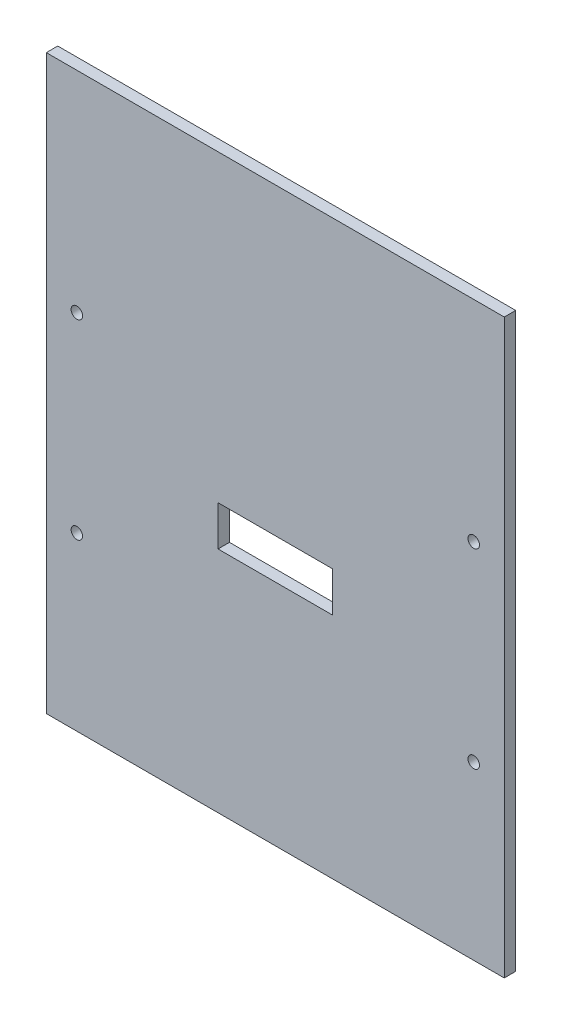
ISO-10303-21;
HEADER;
FILE_DESCRIPTION(('STEP AP214'),'2;1');
FILE_NAME('part.step','',(''),(''),'','','');
FILE_SCHEMA(('AUTOMOTIVE_DESIGN { 1 0 10303 214 1 1 1 1 }'));
ENDSEC;
DATA;
#1=APPLICATION_CONTEXT('core data for automotive mechanical design processes');
#2=APPLICATION_PROTOCOL_DEFINITION('international standard','automotive_design',2000,#1);
#3=PRODUCT_CONTEXT('',#1,'mechanical');
#4=PRODUCT('Part','Part','',(#3));
#5=PRODUCT_RELATED_PRODUCT_CATEGORY('part','',(#4));
#6=PRODUCT_DEFINITION_FORMATION('','',#4);
#7=PRODUCT_DEFINITION_CONTEXT('part definition',#1,'design');
#8=PRODUCT_DEFINITION('design','',#6,#7);
#9=PRODUCT_DEFINITION_SHAPE('','',#8);
#10=(LENGTH_UNIT() NAMED_UNIT(*) SI_UNIT(.MILLI.,.METRE.));
#11=(NAMED_UNIT(*) PLANE_ANGLE_UNIT() SI_UNIT($,.RADIAN.));
#12=(NAMED_UNIT(*) SI_UNIT($,.STERADIAN.) SOLID_ANGLE_UNIT());
#13=UNCERTAINTY_MEASURE_WITH_UNIT(LENGTH_MEASURE(1.E-05),#10,'distance_accuracy_value','');
#14=(GEOMETRIC_REPRESENTATION_CONTEXT(3) GLOBAL_UNCERTAINTY_ASSIGNED_CONTEXT((#13)) GLOBAL_UNIT_ASSIGNED_CONTEXT((#10,
#11,#12)) REPRESENTATION_CONTEXT('',''));
#15=CARTESIAN_POINT('',(0.,0.,0.));
#16=DIRECTION('',(0.,0.,1.));
#17=DIRECTION('',(1.,0.,0.));
#18=AXIS2_PLACEMENT_3D('',#15,#16,#17);
#19=CARTESIAN_POINT('',(0.,0.,3.));
#20=DIRECTION('',(0.,0.,-1.));
#21=DIRECTION('',(-1.,0.,0.));
#22=AXIS2_PLACEMENT_3D('',#19,#20,#21);
#23=PLANE('',#22);
#24=DIRECTION('',(1.,0.,0.));
#25=VECTOR('',#24,1.);
#26=CARTESIAN_POINT('',(0.,70.3610289769367,3.));
#27=LINE('',#26,#25);
#28=CARTESIAN_POINT('',(45.,70.3610289769367,3.));
#29=VERTEX_POINT('',#28);
#30=CARTESIAN_POINT('',(75.,70.3610289769367,3.));
#31=VERTEX_POINT('',#30);
#32=EDGE_CURVE('E144',#29,#31,#27,.T.);
#33=ORIENTED_EDGE('',*,*,#32,.T.);
#34=DIRECTION('',(0.,-1.,0.));
#35=VECTOR('',#34,1.);
#36=CARTESIAN_POINT('',(75.,0.,3.));
#37=LINE('',#36,#35);
#38=CARTESIAN_POINT('',(75.,59.8610289769367,3.));
#39=VERTEX_POINT('',#38);
#40=EDGE_CURVE('E148',#31,#39,#37,.T.);
#41=ORIENTED_EDGE('',*,*,#40,.T.);
#42=DIRECTION('',(-1.,0.,0.));
#43=VECTOR('',#42,1.);
#44=CARTESIAN_POINT('',(0.,59.8610289769367,3.));
#45=LINE('',#44,#43);
#46=CARTESIAN_POINT('',(45.,59.8610289769367,3.));
#47=VERTEX_POINT('',#46);
#48=EDGE_CURVE('E135',#39,#47,#45,.T.);
#49=ORIENTED_EDGE('',*,*,#48,.T.);
#50=DIRECTION('',(0.,1.,0.));
#51=VECTOR('',#50,1.);
#52=CARTESIAN_POINT('',(45.,0.,3.));
#53=LINE('',#52,#51);
#54=EDGE_CURVE('E110',#47,#29,#53,.T.);
#55=ORIENTED_EDGE('',*,*,#54,.T.);
#56=EDGE_LOOP('',(#33,#41,#49,#55));
#57=FACE_BOUND('',#56,.T.);
#58=DIRECTION('',(0.,-1.,0.));
#59=VECTOR('',#58,1.);
#60=CARTESIAN_POINT('',(0.,0.,3.));
#61=LINE('',#60,#59);
#62=CARTESIAN_POINT('',(0.,150.,3.));
#63=VERTEX_POINT('',#62);
#64=CARTESIAN_POINT('',(0.,0.,3.));
#65=VERTEX_POINT('',#64);
#66=EDGE_CURVE('E233',#63,#65,#61,.T.);
#67=ORIENTED_EDGE('',*,*,#66,.T.);
#68=DIRECTION('',(1.,0.,0.));
#69=VECTOR('',#68,1.);
#70=CARTESIAN_POINT('',(0.,0.,3.));
#71=LINE('',#70,#69);
#72=CARTESIAN_POINT('',(120.,0.,3.));
#73=VERTEX_POINT('',#72);
#74=EDGE_CURVE('E237',#65,#73,#71,.T.);
#75=ORIENTED_EDGE('',*,*,#74,.T.);
#76=DIRECTION('',(0.,1.,0.));
#77=VECTOR('',#76,1.);
#78=CARTESIAN_POINT('',(120.,0.,3.));
#79=LINE('',#78,#77);
#80=CARTESIAN_POINT('',(120.,150.,3.));
#81=VERTEX_POINT('',#80);
#82=EDGE_CURVE('E241',#73,#81,#79,.T.);
#83=ORIENTED_EDGE('',*,*,#82,.T.);
#84=DIRECTION('',(-1.,0.,0.));
#85=VECTOR('',#84,1.);
#86=CARTESIAN_POINT('',(0.,150.,3.));
#87=LINE('',#86,#85);
#88=EDGE_CURVE('E244',#81,#63,#87,.T.);
#89=ORIENTED_EDGE('',*,*,#88,.T.);
#90=EDGE_LOOP('',(#67,#75,#83,#89));
#91=FACE_BOUND('',#90,.T.);
#92=CARTESIAN_POINT('',(112.,95.,3.));
#93=DIRECTION('',(0.,0.,1.));
#94=DIRECTION('',(1.,0.,0.));
#95=AXIS2_PLACEMENT_3D('',#92,#93,#94);
#96=CIRCLE('',#95,1.5);
#97=CARTESIAN_POINT('',(113.5,95.,3.));
#98=VERTEX_POINT('',#97);
#99=EDGE_CURVE('E225',#98,#98,#96,.T.);
#100=ORIENTED_EDGE('',*,*,#99,.F.);
#101=EDGE_LOOP('',(#100));
#102=FACE_BOUND('',#101,.T.);
#103=CARTESIAN_POINT('',(112.,45.,3.));
#104=DIRECTION('',(0.,0.,1.));
#105=DIRECTION('',(1.,0.,0.));
#106=AXIS2_PLACEMENT_3D('',#103,#104,#105);
#107=CIRCLE('',#106,1.5);
#108=CARTESIAN_POINT('',(113.5,45.,3.));
#109=VERTEX_POINT('',#108);
#110=EDGE_CURVE('E217',#109,#109,#107,.T.);
#111=ORIENTED_EDGE('',*,*,#110,.F.);
#112=EDGE_LOOP('',(#111));
#113=FACE_BOUND('',#112,.T.);
#114=CARTESIAN_POINT('',(8.00000000000004,45.,3.));
#115=DIRECTION('',(0.,0.,1.));
#116=DIRECTION('',(-1.,0.,0.));
#117=AXIS2_PLACEMENT_3D('',#114,#115,#116);
#118=CIRCLE('',#117,1.5);
#119=CARTESIAN_POINT('',(6.50000000000004,45.,3.));
#120=VERTEX_POINT('',#119);
#121=EDGE_CURVE('E209',#120,#120,#118,.T.);
#122=ORIENTED_EDGE('',*,*,#121,.F.);
#123=EDGE_LOOP('',(#122));
#124=FACE_BOUND('',#123,.T.);
#125=CARTESIAN_POINT('',(8.00000000000002,95.,3.));
#126=DIRECTION('',(0.,0.,1.));
#127=DIRECTION('',(-1.,0.,0.));
#128=AXIS2_PLACEMENT_3D('',#125,#126,#127);
#129=CIRCLE('',#128,1.5);
#130=CARTESIAN_POINT('',(6.50000000000002,95.,3.));
#131=VERTEX_POINT('',#130);
#132=EDGE_CURVE('E201',#131,#131,#129,.T.);
#133=ORIENTED_EDGE('',*,*,#132,.F.);
#134=EDGE_LOOP('',(#133));
#135=FACE_BOUND('',#134,.T.);
#136=ADVANCED_FACE('F38',(#57,#91,#102,#113,#124,#135),#23,.F.);
#137=CARTESIAN_POINT('',(0.,0.,0.));
#138=DIRECTION('',(0.,0.,-1.));
#139=DIRECTION('',(-1.,0.,0.));
#140=AXIS2_PLACEMENT_3D('',#137,#138,#139);
#141=PLANE('',#140);
#142=DIRECTION('',(0.,-1.,0.));
#143=VECTOR('',#142,1.);
#144=CARTESIAN_POINT('',(75.,59.8610289769367,0.));
#145=LINE('',#144,#143);
#146=CARTESIAN_POINT('',(75.,70.3610289769367,0.));
#147=VERTEX_POINT('',#146);
#148=CARTESIAN_POINT('',(75.,59.8610289769367,0.));
#149=VERTEX_POINT('',#148);
#150=EDGE_CURVE('E62',#147,#149,#145,.T.);
#151=ORIENTED_EDGE('',*,*,#150,.F.);
#152=DIRECTION('',(1.,0.,0.));
#153=VECTOR('',#152,1.);
#154=CARTESIAN_POINT('',(75.,70.3610289769367,0.));
#155=LINE('',#154,#153);
#156=CARTESIAN_POINT('',(45.,70.3610289769367,0.));
#157=VERTEX_POINT('',#156);
#158=EDGE_CURVE('E125',#157,#147,#155,.T.);
#159=ORIENTED_EDGE('',*,*,#158,.F.);
#160=DIRECTION('',(0.,1.,0.));
#161=VECTOR('',#160,1.);
#162=CARTESIAN_POINT('',(45.,70.3610289769367,0.));
#163=LINE('',#162,#161);
#164=CARTESIAN_POINT('',(45.,59.8610289769367,0.));
#165=VERTEX_POINT('',#164);
#166=EDGE_CURVE('E107',#165,#157,#163,.T.);
#167=ORIENTED_EDGE('',*,*,#166,.F.);
#168=DIRECTION('',(-1.,0.,0.));
#169=VECTOR('',#168,1.);
#170=CARTESIAN_POINT('',(45.,59.8610289769367,0.));
#171=LINE('',#170,#169);
#172=EDGE_CURVE('E117',#149,#165,#171,.T.);
#173=ORIENTED_EDGE('',*,*,#172,.F.);
#174=EDGE_LOOP('',(#151,#159,#167,#173));
#175=FACE_BOUND('',#174,.T.);
#176=CARTESIAN_POINT('',(42.75,53.3041259645697,0.));
#177=DIRECTION('',(0.,0.,-1.));
#178=DIRECTION('',(1.,0.,0.));
#179=AXIS2_PLACEMENT_3D('',#176,#177,#178);
#180=CIRCLE('',#179,2.40336539543964);
#181=CARTESIAN_POINT('',(45.1533653954396,53.3041259645697,0.));
#182=VERTEX_POINT('',#181);
#183=EDGE_CURVE('E156',#182,#182,#180,.T.);
#184=ORIENTED_EDGE('',*,*,#183,.F.);
#185=EDGE_LOOP('',(#184));
#186=FACE_BOUND('',#185,.T.);
#187=CARTESIAN_POINT('',(77.25,53.3041259645697,0.));
#188=DIRECTION('',(0.,0.,-1.));
#189=DIRECTION('',(-1.,0.,0.));
#190=AXIS2_PLACEMENT_3D('',#187,#188,#189);
#191=CIRCLE('',#190,2.40336539543963);
#192=CARTESIAN_POINT('',(74.8466346045604,53.3041259645697,0.));
#193=VERTEX_POINT('',#192);
#194=EDGE_CURVE('E168',#193,#193,#191,.T.);
#195=ORIENTED_EDGE('',*,*,#194,.F.);
#196=EDGE_LOOP('',(#195));
#197=FACE_BOUND('',#196,.T.);
#198=CARTESIAN_POINT('',(47.6,16.1541259645697,0.));
#199=DIRECTION('',(0.,0.,-1.));
#200=DIRECTION('',(1.,0.,0.));
#201=AXIS2_PLACEMENT_3D('',#198,#199,#200);
#202=CIRCLE('',#201,2.39765674599208);
#203=CARTESIAN_POINT('',(49.9976567459921,16.1541259645697,0.));
#204=VERTEX_POINT('',#203);
#205=EDGE_CURVE('E180',#204,#204,#202,.T.);
#206=ORIENTED_EDGE('',*,*,#205,.F.);
#207=EDGE_LOOP('',(#206));
#208=FACE_BOUND('',#207,.T.);
#209=CARTESIAN_POINT('',(72.4,16.1541259645697,0.));
#210=DIRECTION('',(0.,0.,-1.));
#211=DIRECTION('',(-1.,0.,0.));
#212=AXIS2_PLACEMENT_3D('',#209,#210,#211);
#213=CIRCLE('',#212,2.39765674599208);
#214=CARTESIAN_POINT('',(70.0023432540079,16.1541259645697,0.));
#215=VERTEX_POINT('',#214);
#216=EDGE_CURVE('E192',#215,#215,#213,.T.);
#217=ORIENTED_EDGE('',*,*,#216,.F.);
#218=EDGE_LOOP('',(#217));
#219=FACE_BOUND('',#218,.T.);
#220=CARTESIAN_POINT('',(8.00000000000004,45.,0.));
#221=DIRECTION('',(0.,0.,1.));
#222=DIRECTION('',(-1.,0.,0.));
#223=AXIS2_PLACEMENT_3D('',#220,#221,#222);
#224=CIRCLE('',#223,1.5);
#225=CARTESIAN_POINT('',(6.50000000000004,45.,0.));
#226=VERTEX_POINT('',#225);
#227=EDGE_CURVE('E205',#226,#226,#224,.T.);
#228=ORIENTED_EDGE('',*,*,#227,.T.);
#229=EDGE_LOOP('',(#228));
#230=FACE_BOUND('',#229,.T.);
#231=CARTESIAN_POINT('',(112.,95.,0.));
#232=DIRECTION('',(0.,0.,1.));
#233=DIRECTION('',(1.,0.,0.));
#234=AXIS2_PLACEMENT_3D('',#231,#232,#233);
#235=CIRCLE('',#234,1.5);
#236=CARTESIAN_POINT('',(113.5,95.,0.));
#237=VERTEX_POINT('',#236);
#238=EDGE_CURVE('E221',#237,#237,#235,.T.);
#239=ORIENTED_EDGE('',*,*,#238,.T.);
#240=EDGE_LOOP('',(#239));
#241=FACE_BOUND('',#240,.T.);
#242=DIRECTION('',(0.,-1.,0.));
#243=VECTOR('',#242,1.);
#244=CARTESIAN_POINT('',(0.,0.,0.));
#245=LINE('',#244,#243);
#246=CARTESIAN_POINT('',(0.,150.,0.));
#247=VERTEX_POINT('',#246);
#248=CARTESIAN_POINT('',(0.,0.,0.));
#249=VERTEX_POINT('',#248);
#250=EDGE_CURVE('E229',#247,#249,#245,.T.);
#251=ORIENTED_EDGE('',*,*,#250,.F.);
#252=DIRECTION('',(-1.,0.,0.));
#253=VECTOR('',#252,1.);
#254=CARTESIAN_POINT('',(0.,150.,0.));
#255=LINE('',#254,#253);
#256=CARTESIAN_POINT('',(120.,150.,0.));
#257=VERTEX_POINT('',#256);
#258=EDGE_CURVE('E238',#257,#247,#255,.T.);
#259=ORIENTED_EDGE('',*,*,#258,.F.);
#260=DIRECTION('',(0.,1.,0.));
#261=VECTOR('',#260,1.);
#262=CARTESIAN_POINT('',(120.,0.,0.));
#263=LINE('',#262,#261);
#264=CARTESIAN_POINT('',(120.,0.,0.));
#265=VERTEX_POINT('',#264);
#266=EDGE_CURVE('E254',#265,#257,#263,.T.);
#267=ORIENTED_EDGE('',*,*,#266,.F.);
#268=DIRECTION('',(1.,0.,0.));
#269=VECTOR('',#268,1.);
#270=CARTESIAN_POINT('',(0.,0.,0.));
#271=LINE('',#270,#269);
#272=EDGE_CURVE('E251',#249,#265,#271,.T.);
#273=ORIENTED_EDGE('',*,*,#272,.F.);
#274=EDGE_LOOP('',(#251,#259,#267,#273));
#275=FACE_BOUND('',#274,.T.);
#276=CARTESIAN_POINT('',(112.,45.,0.));
#277=DIRECTION('',(0.,0.,1.));
#278=DIRECTION('',(1.,0.,0.));
#279=AXIS2_PLACEMENT_3D('',#276,#277,#278);
#280=CIRCLE('',#279,1.5);
#281=CARTESIAN_POINT('',(113.5,45.,0.));
#282=VERTEX_POINT('',#281);
#283=EDGE_CURVE('E213',#282,#282,#280,.T.);
#284=ORIENTED_EDGE('',*,*,#283,.T.);
#285=EDGE_LOOP('',(#284));
#286=FACE_BOUND('',#285,.T.);
#287=CARTESIAN_POINT('',(8.00000000000002,95.,0.));
#288=DIRECTION('',(0.,0.,1.));
#289=DIRECTION('',(-1.,0.,0.));
#290=AXIS2_PLACEMENT_3D('',#287,#288,#289);
#291=CIRCLE('',#290,1.5);
#292=CARTESIAN_POINT('',(6.50000000000002,95.,0.));
#293=VERTEX_POINT('',#292);
#294=EDGE_CURVE('E197',#293,#293,#291,.T.);
#295=ORIENTED_EDGE('',*,*,#294,.T.);
#296=EDGE_LOOP('',(#295));
#297=FACE_BOUND('',#296,.T.);
#298=ADVANCED_FACE('F122',(#175,#186,#197,#208,#219,#230,#241,#275,#286,#297),#141,.T.);
#299=CARTESIAN_POINT('',(0.,0.,3.));
#300=DIRECTION('',(1.,0.,0.));
#301=DIRECTION('',(0.,0.,-1.));
#302=AXIS2_PLACEMENT_3D('',#299,#300,#301);
#303=PLANE('',#302);
#304=ORIENTED_EDGE('',*,*,#250,.T.);
#305=DIRECTION('',(0.,0.,-1.));
#306=VECTOR('',#305,1.);
#307=CARTESIAN_POINT('',(0.,0.,3.));
#308=LINE('',#307,#306);
#309=EDGE_CURVE('E270',#65,#249,#308,.T.);
#310=ORIENTED_EDGE('',*,*,#309,.F.);
#311=ORIENTED_EDGE('',*,*,#66,.F.);
#312=DIRECTION('',(0.,0.,-1.));
#313=VECTOR('',#312,1.);
#314=CARTESIAN_POINT('',(0.,150.,3.));
#315=LINE('',#314,#313);
#316=EDGE_CURVE('E247',#63,#247,#315,.T.);
#317=ORIENTED_EDGE('',*,*,#316,.T.);
#318=EDGE_LOOP('',(#304,#310,#311,#317));
#319=FACE_BOUND('',#318,.T.);
#320=ADVANCED_FACE('F40',(#319),#303,.F.);
#321=CARTESIAN_POINT('',(0.,0.,3.));
#322=DIRECTION('',(0.,1.,0.));
#323=DIRECTION('',(0.,0.,1.));
#324=AXIS2_PLACEMENT_3D('',#321,#322,#323);
#325=PLANE('',#324);
#326=ORIENTED_EDGE('',*,*,#272,.T.);
#327=DIRECTION('',(0.,0.,-1.));
#328=VECTOR('',#327,1.);
#329=CARTESIAN_POINT('',(120.,0.,3.));
#330=LINE('',#329,#328);
#331=EDGE_CURVE('E266',#73,#265,#330,.T.);
#332=ORIENTED_EDGE('',*,*,#331,.F.);
#333=ORIENTED_EDGE('',*,*,#74,.F.);
#334=ORIENTED_EDGE('',*,*,#309,.T.);
#335=EDGE_LOOP('',(#326,#332,#333,#334));
#336=FACE_BOUND('',#335,.T.);
#337=ADVANCED_FACE('F523',(#336),#325,.F.);
#338=CARTESIAN_POINT('',(120.,0.,3.));
#339=DIRECTION('',(-1.,0.,0.));
#340=DIRECTION('',(0.,0.,1.));
#341=AXIS2_PLACEMENT_3D('',#338,#339,#340);
#342=PLANE('',#341);
#343=ORIENTED_EDGE('',*,*,#266,.T.);
#344=DIRECTION('',(0.,0.,-1.));
#345=VECTOR('',#344,1.);
#346=CARTESIAN_POINT('',(120.,150.,3.));
#347=LINE('',#346,#345);
#348=EDGE_CURVE('E262',#81,#257,#347,.T.);
#349=ORIENTED_EDGE('',*,*,#348,.F.);
#350=ORIENTED_EDGE('',*,*,#82,.F.);
#351=ORIENTED_EDGE('',*,*,#331,.T.);
#352=EDGE_LOOP('',(#343,#349,#350,#351));
#353=FACE_BOUND('',#352,.T.);
#354=ADVANCED_FACE('F515',(#353),#342,.F.);
#355=CARTESIAN_POINT('',(0.,150.,3.));
#356=DIRECTION('',(0.,-1.,0.));
#357=DIRECTION('',(0.,0.,-1.));
#358=AXIS2_PLACEMENT_3D('',#355,#356,#357);
#359=PLANE('',#358);
#360=ORIENTED_EDGE('',*,*,#258,.T.);
#361=ORIENTED_EDGE('',*,*,#316,.F.);
#362=ORIENTED_EDGE('',*,*,#88,.F.);
#363=ORIENTED_EDGE('',*,*,#348,.T.);
#364=EDGE_LOOP('',(#360,#361,#362,#363));
#365=FACE_BOUND('',#364,.T.);
#366=ADVANCED_FACE('F326',(#365),#359,.F.);
#367=CARTESIAN_POINT('',(112.,95.,3.));
#368=DIRECTION('',(0.,0.,-1.));
#369=DIRECTION('',(-1.,0.,0.));
#370=AXIS2_PLACEMENT_3D('',#367,#368,#369);
#371=CYLINDRICAL_SURFACE('',#370,1.5);
#372=ORIENTED_EDGE('',*,*,#99,.T.);
#373=EDGE_LOOP('',(#372));
#374=FACE_BOUND('',#373,.T.);
#375=ORIENTED_EDGE('',*,*,#238,.F.);
#376=EDGE_LOOP('',(#375));
#377=FACE_BOUND('',#376,.T.);
#378=ADVANCED_FACE('F322',(#374,#377),#371,.F.);
#379=CARTESIAN_POINT('',(112.,45.,3.));
#380=DIRECTION('',(0.,0.,-1.));
#381=DIRECTION('',(-1.,0.,0.));
#382=AXIS2_PLACEMENT_3D('',#379,#380,#381);
#383=CYLINDRICAL_SURFACE('',#382,1.5);
#384=ORIENTED_EDGE('',*,*,#110,.T.);
#385=EDGE_LOOP('',(#384));
#386=FACE_BOUND('',#385,.T.);
#387=ORIENTED_EDGE('',*,*,#283,.F.);
#388=EDGE_LOOP('',(#387));
#389=FACE_BOUND('',#388,.T.);
#390=ADVANCED_FACE('F325',(#386,#389),#383,.F.);
#391=CARTESIAN_POINT('',(8.00000000000004,45.,3.));
#392=DIRECTION('',(0.,0.,-1.));
#393=DIRECTION('',(-1.,0.,0.));
#394=AXIS2_PLACEMENT_3D('',#391,#392,#393);
#395=CYLINDRICAL_SURFACE('',#394,1.5);
#396=ORIENTED_EDGE('',*,*,#121,.T.);
#397=EDGE_LOOP('',(#396));
#398=FACE_BOUND('',#397,.T.);
#399=ORIENTED_EDGE('',*,*,#227,.F.);
#400=EDGE_LOOP('',(#399));
#401=FACE_BOUND('',#400,.T.);
#402=ADVANCED_FACE('F330',(#398,#401),#395,.F.);
#403=CARTESIAN_POINT('',(8.00000000000002,95.,3.));
#404=DIRECTION('',(0.,0.,-1.));
#405=DIRECTION('',(-1.,0.,0.));
#406=AXIS2_PLACEMENT_3D('',#403,#404,#405);
#407=CYLINDRICAL_SURFACE('',#406,1.5);
#408=ORIENTED_EDGE('',*,*,#132,.T.);
#409=EDGE_LOOP('',(#408));
#410=FACE_BOUND('',#409,.T.);
#411=ORIENTED_EDGE('',*,*,#294,.F.);
#412=EDGE_LOOP('',(#411));
#413=FACE_BOUND('',#412,.T.);
#414=ADVANCED_FACE('F334',(#410,#413),#407,.F.);
#415=CARTESIAN_POINT('',(72.4,16.1541259645697,-4.));
#416=DIRECTION('',(0.,0.,-1.));
#417=DIRECTION('',(-1.,0.,0.));
#418=AXIS2_PLACEMENT_3D('',#415,#416,#417);
#419=PLANE('',#418);
#420=CARTESIAN_POINT('',(72.4,16.1541259645697,-4.));
#421=DIRECTION('',(0.,0.,-1.));
#422=DIRECTION('',(-1.,0.,0.));
#423=AXIS2_PLACEMENT_3D('',#420,#421,#422);
#424=CIRCLE('',#423,2.39765674599208);
#425=CARTESIAN_POINT('',(70.0023432540079,16.1541259645697,-4.));
#426=VERTEX_POINT('',#425);
#427=EDGE_CURVE('E193',#426,#426,#424,.T.);
#428=ORIENTED_EDGE('',*,*,#427,.T.);
#429=EDGE_LOOP('',(#428));
#430=FACE_BOUND('',#429,.T.);
#431=CARTESIAN_POINT('',(72.4,16.1541259645697,-4.));
#432=DIRECTION('',(0.,0.,-1.));
#433=DIRECTION('',(-1.,0.,0.));
#434=AXIS2_PLACEMENT_3D('',#431,#432,#433);
#435=CIRCLE('',#434,1.25);
#436=CARTESIAN_POINT('',(71.15,16.1541259645697,-4.));
#437=VERTEX_POINT('',#436);
#438=EDGE_CURVE('E185',#437,#437,#435,.T.);
#439=ORIENTED_EDGE('',*,*,#438,.F.);
#440=EDGE_LOOP('',(#439));
#441=FACE_BOUND('',#440,.T.);
#442=ADVANCED_FACE('F338',(#430,#441),#419,.T.);
#443=CARTESIAN_POINT('',(72.4,16.1541259645697,-4.));
#444=DIRECTION('',(0.,0.,1.));
#445=DIRECTION('',(1.,0.,0.));
#446=AXIS2_PLACEMENT_3D('',#443,#444,#445);
#447=CYLINDRICAL_SURFACE('',#446,2.39765674599208);
#448=ORIENTED_EDGE('',*,*,#427,.F.);
#449=EDGE_LOOP('',(#448));
#450=FACE_BOUND('',#449,.T.);
#451=ORIENTED_EDGE('',*,*,#216,.T.);
#452=EDGE_LOOP('',(#451));
#453=FACE_BOUND('',#452,.T.);
#454=ADVANCED_FACE('F340',(#450,#453),#447,.T.);
#455=CARTESIAN_POINT('',(72.4,16.1541259645697,-4.));
#456=DIRECTION('',(0.,0.,1.));
#457=DIRECTION('',(1.,0.,0.));
#458=AXIS2_PLACEMENT_3D('',#455,#456,#457);
#459=CYLINDRICAL_SURFACE('',#458,1.25);
#460=ORIENTED_EDGE('',*,*,#438,.T.);
#461=EDGE_LOOP('',(#460));
#462=FACE_BOUND('',#461,.T.);
#463=CARTESIAN_POINT('',(72.4,16.1541259645697,0.));
#464=DIRECTION('',(0.,0.,-1.));
#465=DIRECTION('',(-1.,0.,0.));
#466=AXIS2_PLACEMENT_3D('',#463,#464,#465);
#467=CIRCLE('',#466,1.25);
#468=CARTESIAN_POINT('',(71.15,16.1541259645697,0.));
#469=VERTEX_POINT('',#468);
#470=EDGE_CURVE('E274',#469,#469,#467,.F.);
#471=ORIENTED_EDGE('',*,*,#470,.T.);
#472=EDGE_LOOP('',(#471));
#473=FACE_BOUND('',#472,.T.);
#474=ADVANCED_FACE('F343',(#462,#473),#459,.F.);
#475=ORIENTED_EDGE('',*,*,#470,.F.);
#476=EDGE_LOOP('',(#475));
#477=FACE_BOUND('',#476,.T.);
#478=ADVANCED_FACE('F309',(#477),#141,.T.);
#479=CARTESIAN_POINT('',(47.6,16.1541259645697,-4.));
#480=DIRECTION('',(0.,0.,1.));
#481=DIRECTION('',(1.,0.,0.));
#482=AXIS2_PLACEMENT_3D('',#479,#480,#481);
#483=PLANE('',#482);
#484=CARTESIAN_POINT('',(47.6,16.1541259645697,-4.));
#485=DIRECTION('',(0.,0.,-1.));
#486=DIRECTION('',(1.,0.,0.));
#487=AXIS2_PLACEMENT_3D('',#484,#485,#486);
#488=CIRCLE('',#487,2.39765674599208);
#489=CARTESIAN_POINT('',(49.9976567459921,16.1541259645697,-4.));
#490=VERTEX_POINT('',#489);
#491=EDGE_CURVE('E181',#490,#490,#488,.T.);
#492=ORIENTED_EDGE('',*,*,#491,.T.);
#493=EDGE_LOOP('',(#492));
#494=FACE_BOUND('',#493,.T.);
#495=CARTESIAN_POINT('',(47.6,16.1541259645697,-4.));
#496=DIRECTION('',(0.,0.,-1.));
#497=DIRECTION('',(1.,0.,0.));
#498=AXIS2_PLACEMENT_3D('',#495,#496,#497);
#499=CIRCLE('',#498,1.25);
#500=CARTESIAN_POINT('',(48.85,16.1541259645697,-4.));
#501=VERTEX_POINT('',#500);
#502=EDGE_CURVE('E173',#501,#501,#499,.T.);
#503=ORIENTED_EDGE('',*,*,#502,.F.);
#504=EDGE_LOOP('',(#503));
#505=FACE_BOUND('',#504,.T.);
#506=ADVANCED_FACE('F354',(#494,#505),#483,.F.);
#507=CARTESIAN_POINT('',(47.6,16.1541259645697,-4.));
#508=DIRECTION('',(0.,0.,1.));
#509=DIRECTION('',(1.,0.,0.));
#510=AXIS2_PLACEMENT_3D('',#507,#508,#509);
#511=CYLINDRICAL_SURFACE('',#510,2.39765674599208);
#512=ORIENTED_EDGE('',*,*,#491,.F.);
#513=EDGE_LOOP('',(#512));
#514=FACE_BOUND('',#513,.T.);
#515=ORIENTED_EDGE('',*,*,#205,.T.);
#516=EDGE_LOOP('',(#515));
#517=FACE_BOUND('',#516,.T.);
#518=ADVANCED_FACE('F351',(#514,#517),#511,.T.);
#519=CARTESIAN_POINT('',(47.6,16.1541259645697,-4.));
#520=DIRECTION('',(0.,0.,1.));
#521=DIRECTION('',(1.,0.,0.));
#522=AXIS2_PLACEMENT_3D('',#519,#520,#521);
#523=CYLINDRICAL_SURFACE('',#522,1.25);
#524=ORIENTED_EDGE('',*,*,#502,.T.);
#525=EDGE_LOOP('',(#524));
#526=FACE_BOUND('',#525,.T.);
#527=CARTESIAN_POINT('',(47.6,16.1541259645697,0.));
#528=DIRECTION('',(0.,0.,-1.));
#529=DIRECTION('',(-1.,0.,0.));
#530=AXIS2_PLACEMENT_3D('',#527,#528,#529);
#531=CIRCLE('',#530,1.25);
#532=CARTESIAN_POINT('',(46.35,16.1541259645697,0.));
#533=VERTEX_POINT('',#532);
#534=EDGE_CURVE('E278',#533,#533,#531,.F.);
#535=ORIENTED_EDGE('',*,*,#534,.T.);
#536=EDGE_LOOP('',(#535));
#537=FACE_BOUND('',#536,.T.);
#538=ADVANCED_FACE('F307',(#526,#537),#523,.F.);
#539=ORIENTED_EDGE('',*,*,#534,.F.);
#540=EDGE_LOOP('',(#539));
#541=FACE_BOUND('',#540,.T.);
#542=ADVANCED_FACE('F291',(#541),#141,.T.);
#543=CARTESIAN_POINT('',(77.25,53.3041259645697,-4.));
#544=DIRECTION('',(0.,0.,-1.));
#545=DIRECTION('',(-1.,0.,0.));
#546=AXIS2_PLACEMENT_3D('',#543,#544,#545);
#547=PLANE('',#546);
#548=CARTESIAN_POINT('',(77.25,53.3041259645697,-4.));
#549=DIRECTION('',(0.,0.,-1.));
#550=DIRECTION('',(-1.,0.,0.));
#551=AXIS2_PLACEMENT_3D('',#548,#549,#550);
#552=CIRCLE('',#551,2.40336539543963);
#553=CARTESIAN_POINT('',(74.8466346045604,53.3041259645697,-4.));
#554=VERTEX_POINT('',#553);
#555=EDGE_CURVE('E169',#554,#554,#552,.T.);
#556=ORIENTED_EDGE('',*,*,#555,.T.);
#557=EDGE_LOOP('',(#556));
#558=FACE_BOUND('',#557,.T.);
#559=CARTESIAN_POINT('',(77.25,53.3041259645697,-4.));
#560=DIRECTION('',(0.,0.,-1.));
#561=DIRECTION('',(-1.,0.,0.));
#562=AXIS2_PLACEMENT_3D('',#559,#560,#561);
#563=CIRCLE('',#562,1.25);
#564=CARTESIAN_POINT('',(76.,53.3041259645697,-4.));
#565=VERTEX_POINT('',#564);
#566=EDGE_CURVE('E161',#565,#565,#563,.T.);
#567=ORIENTED_EDGE('',*,*,#566,.F.);
#568=EDGE_LOOP('',(#567));
#569=FACE_BOUND('',#568,.T.);
#570=ADVANCED_FACE('F306',(#558,#569),#547,.T.);
#571=CARTESIAN_POINT('',(77.25,53.3041259645697,-4.));
#572=DIRECTION('',(0.,0.,1.));
#573=DIRECTION('',(1.,0.,0.));
#574=AXIS2_PLACEMENT_3D('',#571,#572,#573);
#575=CYLINDRICAL_SURFACE('',#574,2.40336539543963);
#576=ORIENTED_EDGE('',*,*,#555,.F.);
#577=EDGE_LOOP('',(#576));
#578=FACE_BOUND('',#577,.T.);
#579=ORIENTED_EDGE('',*,*,#194,.T.);
#580=EDGE_LOOP('',(#579));
#581=FACE_BOUND('',#580,.T.);
#582=ADVANCED_FACE('F300',(#578,#581),#575,.T.);
#583=CARTESIAN_POINT('',(77.25,53.3041259645697,-4.));
#584=DIRECTION('',(0.,0.,1.));
#585=DIRECTION('',(1.,0.,0.));
#586=AXIS2_PLACEMENT_3D('',#583,#584,#585);
#587=CYLINDRICAL_SURFACE('',#586,1.25);
#588=ORIENTED_EDGE('',*,*,#566,.T.);
#589=EDGE_LOOP('',(#588));
#590=FACE_BOUND('',#589,.T.);
#591=CARTESIAN_POINT('',(77.25,53.3041259645697,0.));
#592=DIRECTION('',(0.,0.,-1.));
#593=DIRECTION('',(-1.,0.,0.));
#594=AXIS2_PLACEMENT_3D('',#591,#592,#593);
#595=CIRCLE('',#594,1.25);
#596=CARTESIAN_POINT('',(76.,53.3041259645697,0.));
#597=VERTEX_POINT('',#596);
#598=EDGE_CURVE('E47',#597,#597,#595,.F.);
#599=ORIENTED_EDGE('',*,*,#598,.T.);
#600=EDGE_LOOP('',(#599));
#601=FACE_BOUND('',#600,.T.);
#602=ADVANCED_FACE('F285',(#590,#601),#587,.F.);
#603=ORIENTED_EDGE('',*,*,#598,.F.);
#604=EDGE_LOOP('',(#603));
#605=FACE_BOUND('',#604,.T.);
#606=ADVANCED_FACE('F287',(#605),#141,.T.);
#607=CARTESIAN_POINT('',(42.75,53.3041259645697,-4.));
#608=DIRECTION('',(0.,0.,1.));
#609=DIRECTION('',(1.,0.,0.));
#610=AXIS2_PLACEMENT_3D('',#607,#608,#609);
#611=PLANE('',#610);
#612=CARTESIAN_POINT('',(42.75,53.3041259645697,-4.));
#613=DIRECTION('',(0.,0.,-1.));
#614=DIRECTION('',(1.,0.,0.));
#615=AXIS2_PLACEMENT_3D('',#612,#613,#614);
#616=CIRCLE('',#615,2.40336539543964);
#617=CARTESIAN_POINT('',(45.1533653954396,53.3041259645697,-4.));
#618=VERTEX_POINT('',#617);
#619=EDGE_CURVE('E157',#618,#618,#616,.T.);
#620=ORIENTED_EDGE('',*,*,#619,.T.);
#621=EDGE_LOOP('',(#620));
#622=FACE_BOUND('',#621,.T.);
#623=CARTESIAN_POINT('',(42.75,53.3041259645697,-4.));
#624=DIRECTION('',(0.,0.,-1.));
#625=DIRECTION('',(1.,0.,0.));
#626=AXIS2_PLACEMENT_3D('',#623,#624,#625);
#627=CIRCLE('',#626,1.25);
#628=CARTESIAN_POINT('',(44.,53.3041259645697,-4.));
#629=VERTEX_POINT('',#628);
#630=EDGE_CURVE('E152',#629,#629,#627,.T.);
#631=ORIENTED_EDGE('',*,*,#630,.F.);
#632=EDGE_LOOP('',(#631));
#633=FACE_BOUND('',#632,.T.);
#634=ADVANCED_FACE('F289',(#622,#633),#611,.F.);
#635=CARTESIAN_POINT('',(42.75,53.3041259645697,-4.));
#636=DIRECTION('',(0.,0.,1.));
#637=DIRECTION('',(1.,0.,0.));
#638=AXIS2_PLACEMENT_3D('',#635,#636,#637);
#639=CYLINDRICAL_SURFACE('',#638,2.40336539543964);
#640=ORIENTED_EDGE('',*,*,#619,.F.);
#641=EDGE_LOOP('',(#640));
#642=FACE_BOUND('',#641,.T.);
#643=ORIENTED_EDGE('',*,*,#183,.T.);
#644=EDGE_LOOP('',(#643));
#645=FACE_BOUND('',#644,.T.);
#646=ADVANCED_FACE('F297',(#642,#645),#639,.T.);
#647=CARTESIAN_POINT('',(42.75,53.3041259645697,-4.));
#648=DIRECTION('',(0.,0.,1.));
#649=DIRECTION('',(1.,0.,0.));
#650=AXIS2_PLACEMENT_3D('',#647,#648,#649);
#651=CYLINDRICAL_SURFACE('',#650,1.25);
#652=ORIENTED_EDGE('',*,*,#630,.T.);
#653=EDGE_LOOP('',(#652));
#654=FACE_BOUND('',#653,.T.);
#655=CARTESIAN_POINT('',(42.75,53.3041259645697,0.));
#656=DIRECTION('',(0.,0.,-1.));
#657=DIRECTION('',(-1.,0.,0.));
#658=AXIS2_PLACEMENT_3D('',#655,#656,#657);
#659=CIRCLE('',#658,1.25);
#660=CARTESIAN_POINT('',(41.5,53.3041259645697,0.));
#661=VERTEX_POINT('',#660);
#662=EDGE_CURVE('E11',#661,#661,#659,.F.);
#663=ORIENTED_EDGE('',*,*,#662,.T.);
#664=EDGE_LOOP('',(#663));
#665=FACE_BOUND('',#664,.T.);
#666=ADVANCED_FACE('F312',(#654,#665),#651,.F.);
#667=ORIENTED_EDGE('',*,*,#662,.F.);
#668=EDGE_LOOP('',(#667));
#669=FACE_BOUND('',#668,.T.);
#670=ADVANCED_FACE('F292',(#669),#141,.T.);
#671=CARTESIAN_POINT('',(75.,59.8610289769367,10.));
#672=DIRECTION('',(1.,0.,0.));
#673=DIRECTION('',(0.,0.,-1.));
#674=AXIS2_PLACEMENT_3D('',#671,#672,#673);
#675=PLANE('',#674);
#676=DIRECTION('',(0.,0.,-1.));
#677=VECTOR('',#676,1.);
#678=CARTESIAN_POINT('',(75.,70.3610289769367,10.));
#679=LINE('',#678,#677);
#680=EDGE_CURVE('E132',#31,#147,#679,.T.);
#681=ORIENTED_EDGE('',*,*,#680,.T.);
#682=ORIENTED_EDGE('',*,*,#150,.T.);
#683=DIRECTION('',(0.,0.,-1.));
#684=VECTOR('',#683,1.);
#685=CARTESIAN_POINT('',(75.,59.8610289769367,10.));
#686=LINE('',#685,#684);
#687=EDGE_CURVE('E114',#39,#149,#686,.T.);
#688=ORIENTED_EDGE('',*,*,#687,.F.);
#689=ORIENTED_EDGE('',*,*,#40,.F.);
#690=EDGE_LOOP('',(#681,#682,#688,#689));
#691=FACE_BOUND('',#690,.T.);
#692=ADVANCED_FACE('F311',(#691),#675,.F.);
#693=CARTESIAN_POINT('',(75.,70.3610289769367,10.));
#694=DIRECTION('',(0.,1.,0.));
#695=DIRECTION('',(0.,0.,1.));
#696=AXIS2_PLACEMENT_3D('',#693,#694,#695);
#697=PLANE('',#696);
#698=DIRECTION('',(0.,0.,-1.));
#699=VECTOR('',#698,1.);
#700=CARTESIAN_POINT('',(45.,70.3610289769367,10.));
#701=LINE('',#700,#699);
#702=EDGE_CURVE('E113',#29,#157,#701,.T.);
#703=ORIENTED_EDGE('',*,*,#702,.T.);
#704=ORIENTED_EDGE('',*,*,#158,.T.);
#705=ORIENTED_EDGE('',*,*,#680,.F.);
#706=ORIENTED_EDGE('',*,*,#32,.F.);
#707=EDGE_LOOP('',(#703,#704,#705,#706));
#708=FACE_BOUND('',#707,.T.);
#709=ADVANCED_FACE('F376',(#708),#697,.F.);
#710=CARTESIAN_POINT('',(45.,70.3610289769367,10.));
#711=DIRECTION('',(-1.,0.,0.));
#712=DIRECTION('',(0.,0.,1.));
#713=AXIS2_PLACEMENT_3D('',#710,#711,#712);
#714=PLANE('',#713);
#715=DIRECTION('',(0.,0.,-1.));
#716=VECTOR('',#715,1.);
#717=CARTESIAN_POINT('',(45.,59.8610289769367,10.));
#718=LINE('',#717,#716);
#719=EDGE_CURVE('E54',#47,#165,#718,.T.);
#720=ORIENTED_EDGE('',*,*,#719,.T.);
#721=ORIENTED_EDGE('',*,*,#166,.T.);
#722=ORIENTED_EDGE('',*,*,#702,.F.);
#723=ORIENTED_EDGE('',*,*,#54,.F.);
#724=EDGE_LOOP('',(#720,#721,#722,#723));
#725=FACE_BOUND('',#724,.T.);
#726=ADVANCED_FACE('F104',(#725),#714,.F.);
#727=CARTESIAN_POINT('',(45.,59.8610289769367,10.));
#728=DIRECTION('',(0.,-1.,0.));
#729=DIRECTION('',(0.,0.,-1.));
#730=AXIS2_PLACEMENT_3D('',#727,#728,#729);
#731=PLANE('',#730);
#732=ORIENTED_EDGE('',*,*,#687,.T.);
#733=ORIENTED_EDGE('',*,*,#172,.T.);
#734=ORIENTED_EDGE('',*,*,#719,.F.);
#735=ORIENTED_EDGE('',*,*,#48,.F.);
#736=EDGE_LOOP('',(#732,#733,#734,#735));
#737=FACE_BOUND('',#736,.T.);
#738=ADVANCED_FACE('F118',(#737),#731,.F.);
#739=CLOSED_SHELL('',(#136,#298,#320,#337,#354,#366,#378,#390,#402,#414,#442,#454,#474,#478,
#506,#518,#538,#542,#570,#582,#602,#606,#634,#646,#666,#670,#692,#709,#726,#738));
#740=MANIFOLD_SOLID_BREP('B2',#739);
#741=ADVANCED_BREP_SHAPE_REPRESENTATION('',(#18,#740),#14);
#742=SHAPE_DEFINITION_REPRESENTATION(#9,#741);
ENDSEC;
END-ISO-10303-21;
